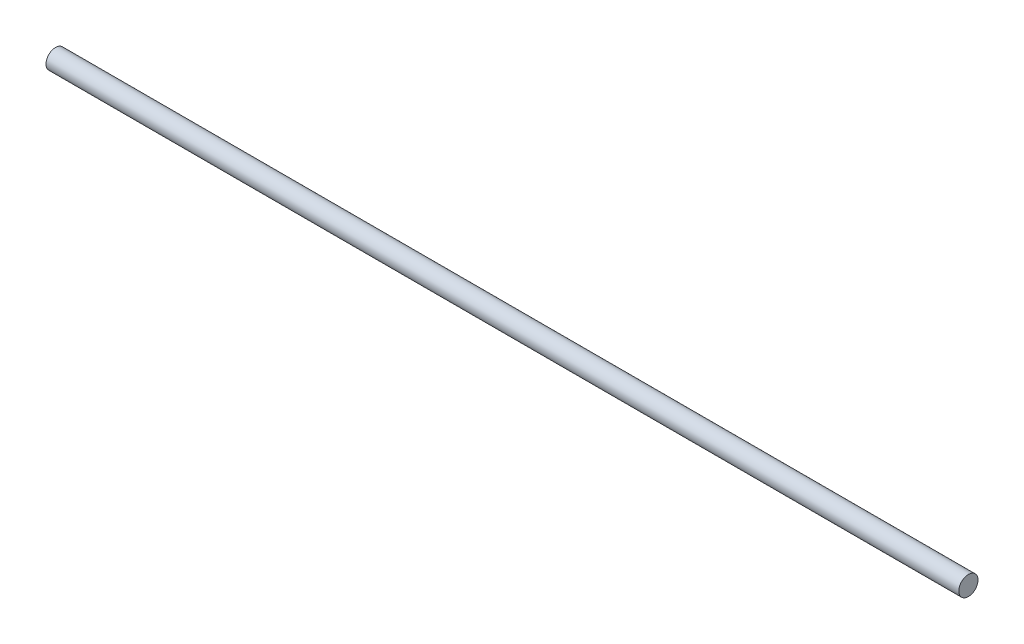
ISO-10303-21;
HEADER;
FILE_DESCRIPTION(('STEP AP214'),'2;1');
FILE_NAME('part.step','',(''),(''),'','','');
FILE_SCHEMA(('AUTOMOTIVE_DESIGN { 1 0 10303 214 1 1 1 1 }'));
ENDSEC;
DATA;
#1=APPLICATION_CONTEXT('core data for automotive mechanical design processes');
#2=APPLICATION_PROTOCOL_DEFINITION('international standard','automotive_design',2000,#1);
#3=PRODUCT_CONTEXT('',#1,'mechanical');
#4=PRODUCT('Part','Part','',(#3));
#5=PRODUCT_RELATED_PRODUCT_CATEGORY('part','',(#4));
#6=PRODUCT_DEFINITION_FORMATION('','',#4);
#7=PRODUCT_DEFINITION_CONTEXT('part definition',#1,'design');
#8=PRODUCT_DEFINITION('design','',#6,#7);
#9=PRODUCT_DEFINITION_SHAPE('','',#8);
#10=(LENGTH_UNIT() NAMED_UNIT(*) SI_UNIT(.MILLI.,.METRE.));
#11=(NAMED_UNIT(*) PLANE_ANGLE_UNIT() SI_UNIT($,.RADIAN.));
#12=(NAMED_UNIT(*) SI_UNIT($,.STERADIAN.) SOLID_ANGLE_UNIT());
#13=UNCERTAINTY_MEASURE_WITH_UNIT(LENGTH_MEASURE(1.E-05),#10,'distance_accuracy_value','');
#14=(GEOMETRIC_REPRESENTATION_CONTEXT(3) GLOBAL_UNCERTAINTY_ASSIGNED_CONTEXT((#13)) GLOBAL_UNIT_ASSIGNED_CONTEXT((#10,
#11,#12)) REPRESENTATION_CONTEXT('',''));
#15=CARTESIAN_POINT('',(0.,0.,0.));
#16=DIRECTION('',(0.,0.,1.));
#17=DIRECTION('',(1.,0.,0.));
#18=AXIS2_PLACEMENT_3D('',#15,#16,#17);
#19=CARTESIAN_POINT('',(95.,0.,0.));
#20=DIRECTION('',(-1.,0.,0.));
#21=DIRECTION('',(0.,0.,1.));
#22=AXIS2_PLACEMENT_3D('',#19,#20,#21);
#23=CYLINDRICAL_SURFACE('',#22,2.);
#24=CARTESIAN_POINT('',(95.,0.,0.));
#25=DIRECTION('',(1.,0.,0.));
#26=DIRECTION('',(0.,0.,-1.));
#27=AXIS2_PLACEMENT_3D('',#24,#25,#26);
#28=CIRCLE('',#27,2.);
#29=CARTESIAN_POINT('',(95.,0.,-2.));
#30=VERTEX_POINT('',#29);
#31=EDGE_CURVE('E10',#30,#30,#28,.T.);
#32=ORIENTED_EDGE('',*,*,#31,.F.);
#33=EDGE_LOOP('',(#32));
#34=FACE_BOUND('',#33,.T.);
#35=CARTESIAN_POINT('',(-95.,0.,0.));
#36=DIRECTION('',(1.,0.,0.));
#37=DIRECTION('',(0.,0.,-1.));
#38=AXIS2_PLACEMENT_3D('',#35,#36,#37);
#39=CIRCLE('',#38,2.);
#40=CARTESIAN_POINT('',(-95.,0.,-2.));
#41=VERTEX_POINT('',#40);
#42=EDGE_CURVE('E33',#41,#41,#39,.T.);
#43=ORIENTED_EDGE('',*,*,#42,.T.);
#44=EDGE_LOOP('',(#43));
#45=FACE_BOUND('',#44,.T.);
#46=ADVANCED_FACE('F30',(#34,#45),#23,.T.);
#47=CARTESIAN_POINT('',(95.,0.,0.));
#48=DIRECTION('',(1.,0.,0.));
#49=DIRECTION('',(0.,0.,-1.));
#50=AXIS2_PLACEMENT_3D('',#47,#48,#49);
#51=PLANE('',#50);
#52=ORIENTED_EDGE('',*,*,#31,.T.);
#53=EDGE_LOOP('',(#52));
#54=FACE_BOUND('',#53,.T.);
#55=ADVANCED_FACE('F45',(#54),#51,.T.);
#56=CARTESIAN_POINT('',(-95.,0.,0.));
#57=DIRECTION('',(1.,0.,0.));
#58=DIRECTION('',(0.,0.,-1.));
#59=AXIS2_PLACEMENT_3D('',#56,#57,#58);
#60=PLANE('',#59);
#61=ORIENTED_EDGE('',*,*,#42,.F.);
#62=EDGE_LOOP('',(#61));
#63=FACE_BOUND('',#62,.T.);
#64=ADVANCED_FACE('F43',(#63),#60,.F.);
#65=CLOSED_SHELL('',(#46,#55,#64));
#66=MANIFOLD_SOLID_BREP('B2',#65);
#67=ADVANCED_BREP_SHAPE_REPRESENTATION('',(#18,#66),#14);
#68=SHAPE_DEFINITION_REPRESENTATION(#9,#67);
ENDSEC;
END-ISO-10303-21;
